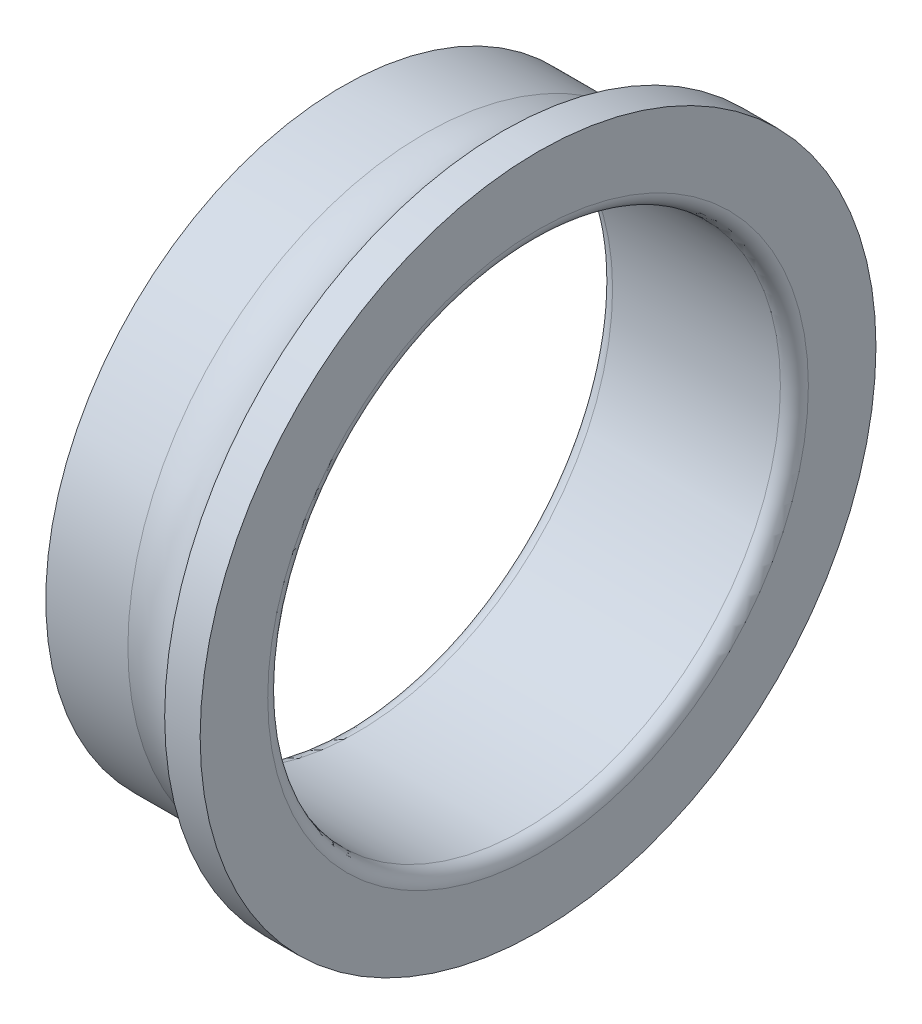
ISO-10303-21;
HEADER;
FILE_DESCRIPTION(('STEP AP214'),'2;1');
FILE_NAME('part.step','',(''),(''),'','','');
FILE_SCHEMA(('AUTOMOTIVE_DESIGN { 1 0 10303 214 1 1 1 1 }'));
ENDSEC;
DATA;
#1=APPLICATION_CONTEXT('core data for automotive mechanical design processes');
#2=APPLICATION_PROTOCOL_DEFINITION('international standard','automotive_design',2000,#1);
#3=PRODUCT_CONTEXT('',#1,'mechanical');
#4=PRODUCT('Part','Part','',(#3));
#5=PRODUCT_RELATED_PRODUCT_CATEGORY('part','',(#4));
#6=PRODUCT_DEFINITION_FORMATION('','',#4);
#7=PRODUCT_DEFINITION_CONTEXT('part definition',#1,'design');
#8=PRODUCT_DEFINITION('design','',#6,#7);
#9=PRODUCT_DEFINITION_SHAPE('','',#8);
#10=(LENGTH_UNIT() NAMED_UNIT(*) SI_UNIT(.MILLI.,.METRE.));
#11=(NAMED_UNIT(*) PLANE_ANGLE_UNIT() SI_UNIT($,.RADIAN.));
#12=(NAMED_UNIT(*) SI_UNIT($,.STERADIAN.) SOLID_ANGLE_UNIT());
#13=UNCERTAINTY_MEASURE_WITH_UNIT(LENGTH_MEASURE(1.E-05),#10,'distance_accuracy_value','');
#14=(GEOMETRIC_REPRESENTATION_CONTEXT(3) GLOBAL_UNCERTAINTY_ASSIGNED_CONTEXT((#13)) GLOBAL_UNIT_ASSIGNED_CONTEXT((#10,
#11,#12)) REPRESENTATION_CONTEXT('',''));
#15=CARTESIAN_POINT('',(0.,0.,0.));
#16=DIRECTION('',(0.,0.,1.));
#17=DIRECTION('',(1.,0.,0.));
#18=AXIS2_PLACEMENT_3D('',#15,#16,#17);
#19=CARTESIAN_POINT('',(0.,-32.1624687924301,-31.81));
#20=DIRECTION('',(-1.,0.,0.));
#21=DIRECTION('',(0.,0.,1.));
#22=AXIS2_PLACEMENT_3D('',#19,#20,#21);
#23=PLANE('',#22);
#24=CARTESIAN_POINT('',(0.,0.,0.));
#25=DIRECTION('',(-1.,0.,0.));
#26=DIRECTION('',(0.,0.,-1.));
#27=AXIS2_PLACEMENT_3D('',#24,#25,#26);
#28=CIRCLE('',#27,31.81);
#29=CARTESIAN_POINT('',(0.,0.,-31.81));
#30=VERTEX_POINT('',#29);
#31=EDGE_CURVE('E44',#30,#30,#28,.F.);
#32=ORIENTED_EDGE('',*,*,#31,.F.);
#33=EDGE_LOOP('',(#32));
#34=FACE_BOUND('',#33,.T.);
#35=CARTESIAN_POINT('',(0.,0.,0.));
#36=DIRECTION('',(1.,0.,0.));
#37=DIRECTION('',(0.,-1.16854535243529E-09,1.));
#38=AXIS2_PLACEMENT_3D('',#35,#36,#37);
#39=CIRCLE('',#38,29.);
#40=CARTESIAN_POINT('',(0.,-3.38878152206235E-08,29.));
#41=VERTEX_POINT('',#40);
#42=EDGE_CURVE('E41',#41,#41,#39,.T.);
#43=ORIENTED_EDGE('',*,*,#42,.T.);
#44=EDGE_LOOP('',(#43));
#45=FACE_BOUND('',#44,.T.);
#46=ADVANCED_FACE('F15',(#34,#45),#23,.T.);
#47=CARTESIAN_POINT('',(21.,-36.651665887137,36.25));
#48=DIRECTION('',(1.,0.,0.));
#49=DIRECTION('',(0.,0.,-1.));
#50=AXIS2_PLACEMENT_3D('',#47,#48,#49);
#51=PLANE('',#50);
#52=CARTESIAN_POINT('',(21.,0.,0.));
#53=DIRECTION('',(1.,0.,0.));
#54=DIRECTION('',(0.,-1.16842451116726E-09,1.));
#55=AXIS2_PLACEMENT_3D('',#52,#53,#54);
#56=CIRCLE('',#55,36.25);
#57=CARTESIAN_POINT('',(21.,-4.23553885298134E-08,36.25));
#58=VERTEX_POINT('',#57);
#59=EDGE_CURVE('E38',#58,#58,#56,.T.);
#60=ORIENTED_EDGE('',*,*,#59,.T.);
#61=EDGE_LOOP('',(#60));
#62=FACE_BOUND('',#61,.T.);
#63=CARTESIAN_POINT('',(21.,0.,0.));
#64=DIRECTION('',(-1.,0.,0.));
#65=DIRECTION('',(0.,0.,-1.));
#66=AXIS2_PLACEMENT_3D('',#63,#64,#65);
#67=CIRCLE('',#66,29.);
#68=CARTESIAN_POINT('',(21.,0.,-29.));
#69=VERTEX_POINT('',#68);
#70=EDGE_CURVE('E35',#69,#69,#67,.F.);
#71=ORIENTED_EDGE('',*,*,#70,.F.);
#72=EDGE_LOOP('',(#71));
#73=FACE_BOUND('',#72,.T.);
#74=ADVANCED_FACE('F53',(#62,#73),#51,.T.);
#75=CARTESIAN_POINT('',(21.,0.,0.));
#76=DIRECTION('',(1.,0.,0.));
#77=DIRECTION('',(0.,0.,1.));
#78=AXIS2_PLACEMENT_3D('',#75,#76,#77);
#79=CYLINDRICAL_SURFACE('',#78,31.81);
#80=ORIENTED_EDGE('',*,*,#31,.T.);
#81=EDGE_LOOP('',(#80));
#82=FACE_BOUND('',#81,.T.);
#83=CARTESIAN_POINT('',(8.8049672569534,0.,0.));
#84=DIRECTION('',(-1.,0.,0.));
#85=DIRECTION('',(0.,0.,-1.));
#86=AXIS2_PLACEMENT_3D('',#83,#84,#85);
#87=CIRCLE('',#86,31.81);
#88=CARTESIAN_POINT('',(8.8049672569534,0.,-31.81));
#89=VERTEX_POINT('',#88);
#90=EDGE_CURVE('E30',#89,#89,#87,.F.);
#91=ORIENTED_EDGE('',*,*,#90,.F.);
#92=EDGE_LOOP('',(#91));
#93=FACE_BOUND('',#92,.T.);
#94=ADVANCED_FACE('F48',(#82,#93),#79,.T.);
#95=CARTESIAN_POINT('',(1.4999999999997,0.,0.));
#96=DIRECTION('',(1.,0.,0.));
#97=DIRECTION('',(0.,0.,1.));
#98=AXIS2_PLACEMENT_3D('',#95,#96,#97);
#99=TOROIDAL_SURFACE('',#98,29.,1.4999999999997);
#100=CARTESIAN_POINT('',(1.5,0.,0.));
#101=DIRECTION('',(1.,0.,0.));
#102=DIRECTION('',(0.,0.,1.));
#103=AXIS2_PLACEMENT_3D('',#100,#101,#102);
#104=CIRCLE('',#103,27.5000000000003);
#105=CARTESIAN_POINT('',(1.5,0.,27.5000000000003));
#106=VERTEX_POINT('',#105);
#107=EDGE_CURVE('E26',#106,#106,#104,.T.);
#108=ORIENTED_EDGE('',*,*,#107,.T.);
#109=EDGE_LOOP('',(#108));
#110=FACE_BOUND('',#109,.T.);
#111=ORIENTED_EDGE('',*,*,#42,.F.);
#112=EDGE_LOOP('',(#111));
#113=FACE_BOUND('',#112,.T.);
#114=ADVANCED_FACE('F57',(#110,#113),#99,.T.);
#115=CARTESIAN_POINT('',(21.,0.,0.));
#116=DIRECTION('',(1.,0.,0.));
#117=DIRECTION('',(0.,0.,1.));
#118=AXIS2_PLACEMENT_3D('',#115,#116,#117);
#119=CYLINDRICAL_SURFACE('',#118,27.5);
#120=CARTESIAN_POINT('',(19.5,0.,0.));
#121=DIRECTION('',(1.,0.,0.));
#122=DIRECTION('',(0.,0.,1.));
#123=AXIS2_PLACEMENT_3D('',#120,#121,#122);
#124=CIRCLE('',#123,27.5);
#125=CARTESIAN_POINT('',(19.5,0.,27.5));
#126=VERTEX_POINT('',#125);
#127=EDGE_CURVE('E22',#126,#126,#124,.T.);
#128=ORIENTED_EDGE('',*,*,#127,.T.);
#129=EDGE_LOOP('',(#128));
#130=FACE_BOUND('',#129,.T.);
#131=ORIENTED_EDGE('',*,*,#107,.F.);
#132=EDGE_LOOP('',(#131));
#133=FACE_BOUND('',#132,.T.);
#134=ADVANCED_FACE('F59',(#130,#133),#119,.F.);
#135=CARTESIAN_POINT('',(19.5000000000006,0.,0.));
#136=DIRECTION('',(1.,0.,0.));
#137=DIRECTION('',(0.,0.,1.));
#138=AXIS2_PLACEMENT_3D('',#135,#136,#137);
#139=TOROIDAL_SURFACE('',#138,28.9999999999994,1.49999999999939);
#140=ORIENTED_EDGE('',*,*,#70,.T.);
#141=EDGE_LOOP('',(#140));
#142=FACE_BOUND('',#141,.T.);
#143=ORIENTED_EDGE('',*,*,#127,.F.);
#144=EDGE_LOOP('',(#143));
#145=FACE_BOUND('',#144,.T.);
#146=ADVANCED_FACE('F67',(#142,#145),#139,.T.);
#147=CARTESIAN_POINT('',(21.,0.,0.));
#148=DIRECTION('',(1.,0.,0.));
#149=DIRECTION('',(0.,0.,1.));
#150=AXIS2_PLACEMENT_3D('',#147,#148,#149);
#151=CYLINDRICAL_SURFACE('',#150,36.25);
#152=CARTESIAN_POINT('',(17.192289294404,0.,0.));
#153=DIRECTION('',(1.,0.,0.));
#154=DIRECTION('',(0.,0.,1.));
#155=AXIS2_PLACEMENT_3D('',#152,#153,#154);
#156=CIRCLE('',#155,36.25);
#157=CARTESIAN_POINT('',(17.192289294404,0.,36.25));
#158=VERTEX_POINT('',#157);
#159=EDGE_CURVE('E10',#158,#158,#156,.T.);
#160=ORIENTED_EDGE('',*,*,#159,.T.);
#161=EDGE_LOOP('',(#160));
#162=FACE_BOUND('',#161,.T.);
#163=ORIENTED_EDGE('',*,*,#59,.F.);
#164=EDGE_LOOP('',(#163));
#165=FACE_BOUND('',#164,.T.);
#166=ADVANCED_FACE('F73',(#162,#165),#151,.T.);
#167=CARTESIAN_POINT('',(10.5000000000004,0.,0.));
#168=DIRECTION('',(1.,0.,0.));
#169=DIRECTION('',(0.,0.,1.));
#170=AXIS2_PLACEMENT_3D('',#167,#168,#169);
#171=TOROIDAL_SURFACE('',#170,38.7499999999986,7.14399999999871);
#172=ORIENTED_EDGE('',*,*,#90,.T.);
#173=EDGE_LOOP('',(#172));
#174=FACE_BOUND('',#173,.T.);
#175=ORIENTED_EDGE('',*,*,#159,.F.);
#176=EDGE_LOOP('',(#175));
#177=FACE_BOUND('',#176,.T.);
#178=ADVANCED_FACE('F17',(#174,#177),#171,.F.);
#179=CLOSED_SHELL('',(#46,#74,#94,#114,#134,#146,#166,#178));
#180=MANIFOLD_SOLID_BREP('B1',#179);
#181=ADVANCED_BREP_SHAPE_REPRESENTATION('',(#18,#180),#14);
#182=SHAPE_DEFINITION_REPRESENTATION(#9,#181);
ENDSEC;
END-ISO-10303-21;
